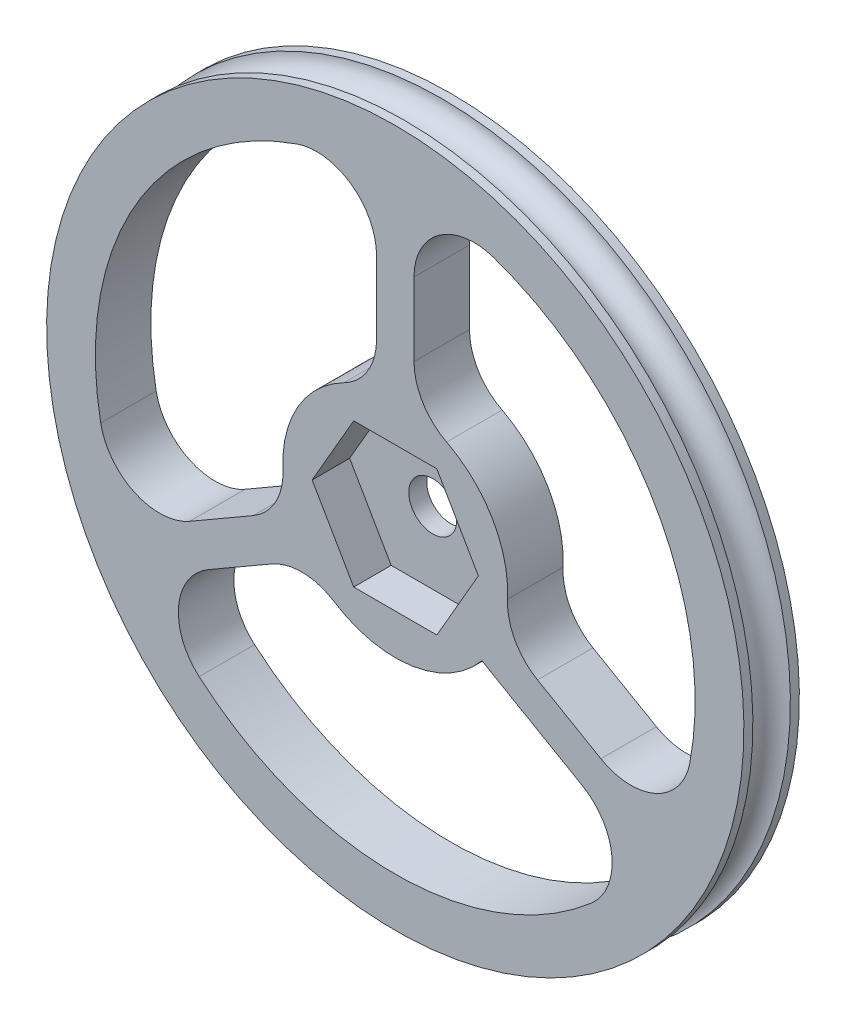
ISO-10303-21;
HEADER;
FILE_DESCRIPTION(('STEP AP214'),'2;1');
FILE_NAME('part.step','',(''),(''),'','','');
FILE_SCHEMA(('AUTOMOTIVE_DESIGN { 1 0 10303 214 1 1 1 1 }'));
ENDSEC;
DATA;
#1=APPLICATION_CONTEXT('core data for automotive mechanical design processes');
#2=APPLICATION_PROTOCOL_DEFINITION('international standard','automotive_design',2000,#1);
#3=PRODUCT_CONTEXT('',#1,'mechanical');
#4=PRODUCT('Part','Part','',(#3));
#5=PRODUCT_RELATED_PRODUCT_CATEGORY('part','',(#4));
#6=PRODUCT_DEFINITION_FORMATION('','',#4);
#7=PRODUCT_DEFINITION_CONTEXT('part definition',#1,'design');
#8=PRODUCT_DEFINITION('design','',#6,#7);
#9=PRODUCT_DEFINITION_SHAPE('','',#8);
#10=(LENGTH_UNIT() NAMED_UNIT(*) SI_UNIT(.MILLI.,.METRE.));
#11=(NAMED_UNIT(*) PLANE_ANGLE_UNIT() SI_UNIT($,.RADIAN.));
#12=(NAMED_UNIT(*) SI_UNIT($,.STERADIAN.) SOLID_ANGLE_UNIT());
#13=UNCERTAINTY_MEASURE_WITH_UNIT(LENGTH_MEASURE(1.E-05),#10,'distance_accuracy_value','');
#14=(GEOMETRIC_REPRESENTATION_CONTEXT(3) GLOBAL_UNCERTAINTY_ASSIGNED_CONTEXT((#13)) GLOBAL_UNIT_ASSIGNED_CONTEXT((#10,
#11,#12)) REPRESENTATION_CONTEXT('',''));
#15=CARTESIAN_POINT('',(0.,0.,0.));
#16=DIRECTION('',(0.,0.,1.));
#17=DIRECTION('',(1.,0.,0.));
#18=AXIS2_PLACEMENT_3D('',#15,#16,#17);
#19=CARTESIAN_POINT('',(-1.5875,0.,-4.699));
#20=DIRECTION('',(-1.,0.,0.));
#21=DIRECTION('',(0.,0.,1.));
#22=AXIS2_PLACEMENT_3D('',#19,#20,#21);
#23=PLANE('',#22);
#24=DIRECTION('',(0.,-1.,0.));
#25=VECTOR('',#24,1.);
#26=CARTESIAN_POINT('',(-1.5875,0.,0.));
#27=LINE('',#26,#25);
#28=CARTESIAN_POINT('',(-1.5875,19.1949692302436,0.));
#29=VERTEX_POINT('',#28);
#30=CARTESIAN_POINT('',(-1.5875,12.9942475253475,0.));
#31=VERTEX_POINT('',#30);
#32=EDGE_CURVE('E340',#29,#31,#27,.T.);
#33=ORIENTED_EDGE('',*,*,#32,.F.);
#34=DIRECTION('',(0.,0.,1.));
#35=VECTOR('',#34,1.);
#36=CARTESIAN_POINT('',(-1.5875,19.1949692302436,-4.699));
#37=LINE('',#36,#35);
#38=CARTESIAN_POINT('',(-1.5875,19.1949692302436,-4.699));
#39=VERTEX_POINT('',#38);
#40=EDGE_CURVE('E416',#29,#39,#37,.F.);
#41=ORIENTED_EDGE('',*,*,#40,.T.);
#42=DIRECTION('',(0.,-1.,0.));
#43=VECTOR('',#42,1.);
#44=CARTESIAN_POINT('',(-1.5875,0.,-4.699));
#45=LINE('',#44,#43);
#46=CARTESIAN_POINT('',(-1.5875,12.9942475253475,-4.699));
#47=VERTEX_POINT('',#46);
#48=EDGE_CURVE('E342',#39,#47,#45,.T.);
#49=ORIENTED_EDGE('',*,*,#48,.T.);
#50=DIRECTION('',(0.,0.,-1.));
#51=VECTOR('',#50,1.);
#52=CARTESIAN_POINT('',(-1.5875,12.9942475253475,0.));
#53=LINE('',#52,#51);
#54=EDGE_CURVE('E413',#47,#31,#53,.F.);
#55=ORIENTED_EDGE('',*,*,#54,.T.);
#56=EDGE_LOOP('',(#33,#41,#49,#55));
#57=FACE_BOUND('',#56,.T.);
#58=ADVANCED_FACE('F35',(#57),#23,.T.);
#59=CARTESIAN_POINT('',(1.5875,0.,-4.699));
#60=DIRECTION('',(1.,0.,0.));
#61=DIRECTION('',(0.,0.,-1.));
#62=AXIS2_PLACEMENT_3D('',#59,#60,#61);
#63=PLANE('',#62);
#64=DIRECTION('',(0.,1.,0.));
#65=VECTOR('',#64,1.);
#66=CARTESIAN_POINT('',(1.5875,0.,-4.699));
#67=LINE('',#66,#65);
#68=CARTESIAN_POINT('',(1.5875,12.9942475253475,-4.699));
#69=VERTEX_POINT('',#68);
#70=CARTESIAN_POINT('',(1.5875,19.1949692302436,-4.699));
#71=VERTEX_POINT('',#70);
#72=EDGE_CURVE('E349',#69,#71,#67,.T.);
#73=ORIENTED_EDGE('',*,*,#72,.T.);
#74=DIRECTION('',(0.,0.,1.));
#75=VECTOR('',#74,1.);
#76=CARTESIAN_POINT('',(1.5875,19.1949692302436,0.));
#77=LINE('',#76,#75);
#78=CARTESIAN_POINT('',(1.5875,19.1949692302436,0.));
#79=VERTEX_POINT('',#78);
#80=EDGE_CURVE('E438',#71,#79,#77,.T.);
#81=ORIENTED_EDGE('',*,*,#80,.T.);
#82=DIRECTION('',(0.,1.,0.));
#83=VECTOR('',#82,1.);
#84=CARTESIAN_POINT('',(1.5875,0.,0.));
#85=LINE('',#84,#83);
#86=CARTESIAN_POINT('',(1.5875,12.9942475253475,0.));
#87=VERTEX_POINT('',#86);
#88=EDGE_CURVE('E346',#87,#79,#85,.T.);
#89=ORIENTED_EDGE('',*,*,#88,.F.);
#90=DIRECTION('',(0.,0.,-1.));
#91=VECTOR('',#90,1.);
#92=CARTESIAN_POINT('',(1.5875,12.9942475253475,-4.699));
#93=LINE('',#92,#91);
#94=EDGE_CURVE('E436',#87,#69,#93,.T.);
#95=ORIENTED_EDGE('',*,*,#94,.T.);
#96=EDGE_LOOP('',(#73,#81,#89,#95));
#97=FACE_BOUND('',#96,.T.);
#98=ADVANCED_FACE('F492',(#97),#63,.T.);
#99=CARTESIAN_POINT('',(0.,0.,-4.699));
#100=DIRECTION('',(0.,0.,1.));
#101=DIRECTION('',(1.,0.,0.));
#102=AXIS2_PLACEMENT_3D('',#99,#100,#101);
#103=CYLINDRICAL_SURFACE('',#102,9.525);
#104=CARTESIAN_POINT('',(0.,0.,0.));
#105=DIRECTION('',(0.,0.,1.));
#106=DIRECTION('',(1.,0.,0.));
#107=AXIS2_PLACEMENT_3D('',#104,#105,#106);
#108=CIRCLE('',#107,9.525);
#109=CARTESIAN_POINT('',(9.5133250826179,-0.471456119308275,0.));
#110=VERTEX_POINT('',#109);
#111=CARTESIAN_POINT('',(4.34836956521739,8.47450925566142,0.));
#112=VERTEX_POINT('',#111);
#113=EDGE_CURVE('E369',#110,#112,#108,.T.);
#114=ORIENTED_EDGE('',*,*,#113,.F.);
#115=DIRECTION('',(0.,0.,1.));
#116=VECTOR('',#115,1.);
#117=CARTESIAN_POINT('',(9.5133250826179,-0.471456119308275,-4.699));
#118=LINE('',#117,#116);
#119=CARTESIAN_POINT('',(9.5133250826179,-0.471456119308275,-4.699));
#120=VERTEX_POINT('',#119);
#121=EDGE_CURVE('E55',#110,#120,#118,.F.);
#122=ORIENTED_EDGE('',*,*,#121,.T.);
#123=CARTESIAN_POINT('',(0.,0.,-4.699));
#124=DIRECTION('',(0.,0.,1.));
#125=DIRECTION('',(1.,0.,0.));
#126=AXIS2_PLACEMENT_3D('',#123,#124,#125);
#127=CIRCLE('',#126,9.525);
#128=CARTESIAN_POINT('',(4.34836956521739,8.47450925566142,-4.699));
#129=VERTEX_POINT('',#128);
#130=EDGE_CURVE('E347',#120,#129,#127,.T.);
#131=ORIENTED_EDGE('',*,*,#130,.T.);
#132=DIRECTION('',(0.,0.,1.));
#133=VECTOR('',#132,1.);
#134=CARTESIAN_POINT('',(4.34836956521739,8.47450925566142,-4.699));
#135=LINE('',#134,#133);
#136=EDGE_CURVE('E441',#129,#112,#135,.T.);
#137=ORIENTED_EDGE('',*,*,#136,.T.);
#138=EDGE_LOOP('',(#114,#122,#131,#137));
#139=FACE_BOUND('',#138,.T.);
#140=ADVANCED_FACE('F494',(#139),#103,.T.);
#141=CARTESIAN_POINT('',(0.793750000000738,1.37481532850908,-4.699));
#142=DIRECTION('',(0.5,0.866025403784439,0.));
#143=DIRECTION('',(-0.866025403784439,0.5,0.));
#144=AXIS2_PLACEMENT_3D('',#141,#142,#143);
#145=PLANE('',#144);
#146=DIRECTION('',(-0.866025403784439,0.5,0.));
#147=VECTOR('',#146,1.);
#148=CARTESIAN_POINT('',(0.793750000000738,1.37481532850908,0.));
#149=LINE('',#148,#147);
#150=CARTESIAN_POINT('',(17.4170809782519,-8.22266928661249,0.));
#151=VERTEX_POINT('',#150);
#152=CARTESIAN_POINT('',(12.0470984600141,-5.1223084341643,0.));
#153=VERTEX_POINT('',#152);
#154=EDGE_CURVE('E372',#151,#153,#149,.T.);
#155=ORIENTED_EDGE('',*,*,#154,.F.);
#156=DIRECTION('',(0.,0.,1.));
#157=VECTOR('',#156,1.);
#158=CARTESIAN_POINT('',(17.4170809782519,-8.22266928661248,-4.699));
#159=LINE('',#158,#157);
#160=CARTESIAN_POINT('',(17.4170809782519,-8.22266928661249,-4.699));
#161=VERTEX_POINT('',#160);
#162=EDGE_CURVE('E434',#151,#161,#159,.F.);
#163=ORIENTED_EDGE('',*,*,#162,.T.);
#164=DIRECTION('',(-0.866025403784439,0.5,0.));
#165=VECTOR('',#164,1.);
#166=CARTESIAN_POINT('',(0.793750000000738,1.37481532850908,-4.699));
#167=LINE('',#166,#165);
#168=CARTESIAN_POINT('',(12.0470984600141,-5.1223084341643,-4.699));
#169=VERTEX_POINT('',#168);
#170=EDGE_CURVE('E350',#161,#169,#167,.T.);
#171=ORIENTED_EDGE('',*,*,#170,.T.);
#172=DIRECTION('',(0.,0.,-1.));
#173=VECTOR('',#172,1.);
#174=CARTESIAN_POINT('',(12.0470984600141,-5.1223084341643,0.));
#175=LINE('',#174,#173);
#176=EDGE_CURVE('E431',#169,#153,#175,.F.);
#177=ORIENTED_EDGE('',*,*,#176,.T.);
#178=EDGE_LOOP('',(#155,#163,#171,#177));
#179=FACE_BOUND('',#178,.T.);
#180=ADVANCED_FACE('F504',(#179),#145,.T.);
#181=CARTESIAN_POINT('',(-0.793749999999262,-1.37481532850652,-4.699));
#182=DIRECTION('',(-0.5,-0.866025403784439,0.));
#183=DIRECTION('',(0.866025403784439,-0.5,0.));
#184=AXIS2_PLACEMENT_3D('',#181,#182,#183);
#185=PLANE('',#184);
#186=DIRECTION('',(0.866025403784439,-0.5,0.));
#187=VECTOR('',#186,1.);
#188=CARTESIAN_POINT('',(-0.793749999999262,-1.37481532850652,-4.699));
#189=LINE('',#188,#187);
#190=CARTESIAN_POINT('',(7.33976717048152,-6.07070365634201,-4.699));
#191=VERTEX_POINT('',#190);
#192=CARTESIAN_POINT('',(15.8295809782528,-10.9722999436286,-4.699));
#193=VERTEX_POINT('',#192);
#194=EDGE_CURVE('E358',#191,#193,#189,.T.);
#195=ORIENTED_EDGE('',*,*,#194,.T.);
#196=DIRECTION('',(0.,0.,1.));
#197=VECTOR('',#196,1.);
#198=CARTESIAN_POINT('',(15.8295809782528,-10.9722999436286,0.));
#199=LINE('',#198,#197);
#200=CARTESIAN_POINT('',(15.8295809782528,-10.9722999436286,0.));
#201=VERTEX_POINT('',#200);
#202=EDGE_CURVE('E418',#193,#201,#199,.T.);
#203=ORIENTED_EDGE('',*,*,#202,.T.);
#204=DIRECTION('',(0.866025403784439,-0.5,0.));
#205=VECTOR('',#204,1.);
#206=CARTESIAN_POINT('',(-0.793749999999262,-1.37481532850652,0.));
#207=LINE('',#206,#205);
#208=CARTESIAN_POINT('',(7.33976717048152,-6.07070365634201,0.));
#209=VERTEX_POINT('',#208);
#210=EDGE_CURVE('E380',#209,#201,#207,.T.);
#211=ORIENTED_EDGE('',*,*,#210,.F.);
#212=DIRECTION('',(0.,0.,1.));
#213=VECTOR('',#212,1.);
#214=CARTESIAN_POINT('',(7.33976717048152,-6.07070365634201,-4.699));
#215=LINE('',#214,#213);
#216=EDGE_CURVE('E365',#191,#209,#215,.T.);
#217=ORIENTED_EDGE('',*,*,#216,.F.);
#218=EDGE_LOOP('',(#195,#203,#211,#217));
#219=FACE_BOUND('',#218,.T.);
#220=ADVANCED_FACE('F591',(#219),#185,.T.);
#221=CARTESIAN_POINT('',(-5.16495551739972,-8.00305313635254,0.));
#222=VERTEX_POINT('',#221);
#223=EDGE_CURVE('E373',#222,#209,#108,.T.);
#224=ORIENTED_EDGE('',*,*,#223,.F.);
#225=DIRECTION('',(0.,0.,1.));
#226=VECTOR('',#225,1.);
#227=CARTESIAN_POINT('',(-5.16495551739972,-8.00305313635254,-4.699));
#228=LINE('',#227,#226);
#229=CARTESIAN_POINT('',(-5.16495551739972,-8.00305313635254,-4.699));
#230=VERTEX_POINT('',#229);
#231=EDGE_CURVE('E411',#222,#230,#228,.F.);
#232=ORIENTED_EDGE('',*,*,#231,.T.);
#233=EDGE_CURVE('E351',#230,#191,#127,.T.);
#234=ORIENTED_EDGE('',*,*,#233,.T.);
#235=ORIENTED_EDGE('',*,*,#216,.T.);
#236=EDGE_LOOP('',(#224,#232,#234,#235));
#237=FACE_BOUND('',#236,.T.);
#238=ADVANCED_FACE('F585',(#237),#103,.T.);
#239=CARTESIAN_POINT('',(0.793750000000592,-1.37481532850882,-4.699));
#240=DIRECTION('',(0.5,-0.866025403784438,0.));
#241=DIRECTION('',(0.866025403784438,0.5,0.));
#242=AXIS2_PLACEMENT_3D('',#239,#240,#241);
#243=PLANE('',#242);
#244=DIRECTION('',(0.866025403784438,0.5,0.));
#245=VECTOR('',#244,1.);
#246=CARTESIAN_POINT('',(0.793750000000592,-1.37481532850882,0.));
#247=LINE('',#246,#245);
#248=CARTESIAN_POINT('',(-15.8295809782507,-10.9722999436304,0.));
#249=VERTEX_POINT('',#248);
#250=CARTESIAN_POINT('',(-10.4595984600129,-7.87193909118228,0.));
#251=VERTEX_POINT('',#250);
#252=EDGE_CURVE('E377',#249,#251,#247,.T.);
#253=ORIENTED_EDGE('',*,*,#252,.F.);
#254=DIRECTION('',(0.,0.,1.));
#255=VECTOR('',#254,1.);
#256=CARTESIAN_POINT('',(-15.8295809782507,-10.9722999436304,-4.699));
#257=LINE('',#256,#255);
#258=CARTESIAN_POINT('',(-15.8295809782507,-10.9722999436304,-4.699));
#259=VERTEX_POINT('',#258);
#260=EDGE_CURVE('E409',#249,#259,#257,.F.);
#261=ORIENTED_EDGE('',*,*,#260,.T.);
#262=DIRECTION('',(0.866025403784438,0.5,0.));
#263=VECTOR('',#262,1.);
#264=CARTESIAN_POINT('',(0.793750000000592,-1.37481532850882,-4.699));
#265=LINE('',#264,#263);
#266=CARTESIAN_POINT('',(-10.4595984600129,-7.87193909118228,-4.699));
#267=VERTEX_POINT('',#266);
#268=EDGE_CURVE('E355',#259,#267,#265,.T.);
#269=ORIENTED_EDGE('',*,*,#268,.T.);
#270=DIRECTION('',(0.,0.,-1.));
#271=VECTOR('',#270,1.);
#272=CARTESIAN_POINT('',(-10.4595984600129,-7.87193909118228,0.));
#273=LINE('',#272,#271);
#274=EDGE_CURVE('E406',#267,#251,#273,.F.);
#275=ORIENTED_EDGE('',*,*,#274,.T.);
#276=EDGE_LOOP('',(#253,#261,#269,#275));
#277=FACE_BOUND('',#276,.T.);
#278=ADVANCED_FACE('F623',(#277),#243,.T.);
#279=CARTESIAN_POINT('',(-0.79374999999941,1.37481532850677,-4.699));
#280=DIRECTION('',(-0.5,0.866025403784438,0.));
#281=DIRECTION('',(-0.866025403784438,-0.500000000000001,0.));
#282=AXIS2_PLACEMENT_3D('',#279,#280,#281);
#283=PLANE('',#282);
#284=DIRECTION('',(-0.866025403784438,-0.500000000000001,0.));
#285=VECTOR('',#284,1.);
#286=CARTESIAN_POINT('',(-0.79374999999941,1.37481532850677,-4.699));
#287=LINE('',#286,#285);
#288=CARTESIAN_POINT('',(-12.047098460014,-5.1223084341673,-4.699));
#289=VERTEX_POINT('',#288);
#290=CARTESIAN_POINT('',(-17.4170809782514,-8.22266928661526,-4.699));
#291=VERTEX_POINT('',#290);
#292=EDGE_CURVE('E352',#289,#291,#287,.T.);
#293=ORIENTED_EDGE('',*,*,#292,.T.);
#294=DIRECTION('',(0.,0.,1.));
#295=VECTOR('',#294,1.);
#296=CARTESIAN_POINT('',(-17.4170809782514,-8.22266928661526,0.));
#297=LINE('',#296,#295);
#298=CARTESIAN_POINT('',(-17.4170809782514,-8.22266928661526,0.));
#299=VERTEX_POINT('',#298);
#300=EDGE_CURVE('E393',#291,#299,#297,.T.);
#301=ORIENTED_EDGE('',*,*,#300,.T.);
#302=DIRECTION('',(-0.866025403784438,-0.500000000000001,0.));
#303=VECTOR('',#302,1.);
#304=CARTESIAN_POINT('',(-0.79374999999941,1.37481532850677,0.));
#305=LINE('',#304,#303);
#306=CARTESIAN_POINT('',(-12.047098460014,-5.1223084341673,0.));
#307=VERTEX_POINT('',#306);
#308=EDGE_CURVE('E374',#307,#299,#305,.T.);
#309=ORIENTED_EDGE('',*,*,#308,.F.);
#310=DIRECTION('',(0.,0.,-1.));
#311=VECTOR('',#310,1.);
#312=CARTESIAN_POINT('',(-12.047098460014,-5.12230843416729,-4.699));
#313=LINE('',#312,#311);
#314=EDGE_CURVE('E389',#307,#289,#313,.T.);
#315=ORIENTED_EDGE('',*,*,#314,.T.);
#316=EDGE_LOOP('',(#293,#301,#309,#315));
#317=FACE_BOUND('',#316,.T.);
#318=ADVANCED_FACE('F536',(#317),#283,.T.);
#319=CARTESIAN_POINT('',(-4.34836956521739,8.47450925566142,0.));
#320=VERTEX_POINT('',#319);
#321=CARTESIAN_POINT('',(-9.5133250826178,-0.471456119310228,0.));
#322=VERTEX_POINT('',#321);
#323=EDGE_CURVE('E368',#320,#322,#108,.T.);
#324=ORIENTED_EDGE('',*,*,#323,.F.);
#325=DIRECTION('',(0.,0.,1.));
#326=VECTOR('',#325,1.);
#327=CARTESIAN_POINT('',(-4.34836956521739,8.47450925566142,-4.699));
#328=LINE('',#327,#326);
#329=CARTESIAN_POINT('',(-4.34836956521739,8.47450925566142,-4.699));
#330=VERTEX_POINT('',#329);
#331=EDGE_CURVE('E424',#320,#330,#328,.F.);
#332=ORIENTED_EDGE('',*,*,#331,.T.);
#333=CARTESIAN_POINT('',(-9.5133250826178,-0.471456119310228,-4.699));
#334=VERTEX_POINT('',#333);
#335=EDGE_CURVE('E345',#330,#334,#127,.T.);
#336=ORIENTED_EDGE('',*,*,#335,.T.);
#337=DIRECTION('',(0.,0.,1.));
#338=VECTOR('',#337,1.);
#339=CARTESIAN_POINT('',(-9.5133250826178,-0.471456119310227,-4.699));
#340=LINE('',#339,#338);
#341=EDGE_CURVE('E421',#334,#322,#340,.T.);
#342=ORIENTED_EDGE('',*,*,#341,.T.);
#343=EDGE_LOOP('',(#324,#332,#336,#342));
#344=FACE_BOUND('',#343,.T.);
#345=ADVANCED_FACE('F578',(#344),#103,.T.);
#346=CARTESIAN_POINT('',(0.,0.,-4.699));
#347=DIRECTION('',(0.,0.,1.));
#348=DIRECTION('',(1.,0.,0.));
#349=AXIS2_PLACEMENT_3D('',#346,#347,#348);
#350=PLANE('',#349);
#351=CARTESIAN_POINT('',(0.,0.,-4.699));
#352=DIRECTION('',(0.,0.,1.));
#353=DIRECTION('',(1.,0.,0.));
#354=AXIS2_PLACEMENT_3D('',#351,#352,#353);
#355=CIRCLE('',#354,2.032);
#356=CARTESIAN_POINT('',(2.032,0.,-4.699));
#357=VERTEX_POINT('',#356);
#358=EDGE_CURVE('E275',#357,#357,#355,.T.);
#359=ORIENTED_EDGE('',*,*,#358,.T.);
#360=EDGE_LOOP('',(#359));
#361=FACE_BOUND('',#360,.T.);
#362=ORIENTED_EDGE('',*,*,#170,.F.);
#363=CARTESIAN_POINT('',(19.9570809782519,-3.82326023538754,-4.699));
#364=DIRECTION('',(0.,0.,1.));
#365=DIRECTION('',(1.,0.,0.));
#366=AXIS2_PLACEMENT_3D('',#363,#364,#365);
#367=CIRCLE('',#366,5.08);
#368=CARTESIAN_POINT('',(24.9463512228149,-4.77907529423442,-4.699));
#369=VERTEX_POINT('',#368);
#370=EDGE_CURVE('E475',#161,#369,#367,.T.);
#371=ORIENTED_EDGE('',*,*,#370,.T.);
#372=CARTESIAN_POINT('',(0.,0.,-4.699));
#373=DIRECTION('',(0.,0.,-1.));
#374=DIRECTION('',(-1.,0.,0.));
#375=AXIS2_PLACEMENT_3D('',#372,#373,#374);
#376=CIRCLE('',#375,25.4);
#377=CARTESIAN_POINT('',(8.334375,23.9937115378045,-4.699));
#378=VERTEX_POINT('',#377);
#379=EDGE_CURVE('E337',#378,#369,#376,.T.);
#380=ORIENTED_EDGE('',*,*,#379,.F.);
#381=CARTESIAN_POINT('',(6.6675,19.1949692302436,-4.699));
#382=DIRECTION('',(0.,0.,1.));
#383=DIRECTION('',(1.,0.,0.));
#384=AXIS2_PLACEMENT_3D('',#381,#382,#383);
#385=CIRCLE('',#384,5.08);
#386=EDGE_CURVE('E479',#378,#71,#385,.T.);
#387=ORIENTED_EDGE('',*,*,#386,.T.);
#388=ORIENTED_EDGE('',*,*,#72,.F.);
#389=CARTESIAN_POINT('',(6.6675,12.9942475253475,-4.699));
#390=DIRECTION('',(0.,0.,1.));
#391=DIRECTION('',(1.,0.,0.));
#392=AXIS2_PLACEMENT_3D('',#389,#390,#391);
#393=CIRCLE('',#392,5.08);
#394=EDGE_CURVE('E11',#69,#129,#393,.T.);
#395=ORIENTED_EDGE('',*,*,#394,.T.);
#396=ORIENTED_EDGE('',*,*,#130,.F.);
#397=CARTESIAN_POINT('',(14.5870984600141,-0.722899382939355,-4.699));
#398=DIRECTION('',(0.,0.,1.));
#399=DIRECTION('',(1.,0.,0.));
#400=AXIS2_PLACEMENT_3D('',#397,#398,#399);
#401=CIRCLE('',#400,5.08);
#402=EDGE_CURVE('E483',#120,#169,#401,.T.);
#403=ORIENTED_EDGE('',*,*,#402,.T.);
#404=EDGE_LOOP('',(#362,#371,#380,#387,#388,#395,#396,#403));
#405=FACE_BOUND('',#404,.T.);
#406=ORIENTED_EDGE('',*,*,#268,.F.);
#407=CARTESIAN_POINT('',(-13.2895809782507,-15.3717089948554,-4.699));
#408=DIRECTION('',(0.,0.,1.));
#409=DIRECTION('',(1.,0.,0.));
#410=AXIS2_PLACEMENT_3D('',#407,#408,#409);
#411=CIRCLE('',#410,5.08);
#412=CARTESIAN_POINT('',(-16.6119762228133,-19.2146362435692,-4.699));
#413=VERTEX_POINT('',#412);
#414=EDGE_CURVE('E451',#259,#413,#411,.T.);
#415=ORIENTED_EDGE('',*,*,#414,.T.);
#416=CARTESIAN_POINT('',(16.611976222816,-19.2146362435669,-4.699));
#417=VERTEX_POINT('',#416);
#418=EDGE_CURVE('E341',#417,#413,#376,.T.);
#419=ORIENTED_EDGE('',*,*,#418,.F.);
#420=CARTESIAN_POINT('',(13.2895809782528,-15.3717089948535,-4.699));
#421=DIRECTION('',(0.,0.,1.));
#422=DIRECTION('',(1.,0.,0.));
#423=AXIS2_PLACEMENT_3D('',#420,#421,#422);
#424=CIRCLE('',#423,5.08);
#425=EDGE_CURVE('E463',#417,#193,#424,.T.);
#426=ORIENTED_EDGE('',*,*,#425,.T.);
#427=ORIENTED_EDGE('',*,*,#194,.F.);
#428=ORIENTED_EDGE('',*,*,#233,.F.);
#429=CARTESIAN_POINT('',(-7.9195984600129,-12.2713481424072,-4.699));
#430=DIRECTION('',(0.,0.,1.));
#431=DIRECTION('',(1.,0.,0.));
#432=AXIS2_PLACEMENT_3D('',#429,#430,#431);
#433=CIRCLE('',#432,5.08);
#434=EDGE_CURVE('E455',#230,#267,#433,.T.);
#435=ORIENTED_EDGE('',*,*,#434,.T.);
#436=EDGE_LOOP('',(#406,#415,#419,#426,#427,#428,#435));
#437=FACE_BOUND('',#436,.T.);
#438=CARTESIAN_POINT('',(0.,0.,-4.699));
#439=DIRECTION('',(0.,0.,-1.));
#440=DIRECTION('',(-1.,0.,0.));
#441=AXIS2_PLACEMENT_3D('',#438,#439,#440);
#442=CIRCLE('',#441,29.5275);
#443=CARTESIAN_POINT('',(0.,29.5275,-4.699));
#444=VERTEX_POINT('',#443);
#445=EDGE_CURVE('E333',#444,#444,#442,.T.);
#446=ORIENTED_EDGE('',*,*,#445,.T.);
#447=EDGE_LOOP('',(#446));
#448=FACE_BOUND('',#447,.T.);
#449=ORIENTED_EDGE('',*,*,#48,.F.);
#450=CARTESIAN_POINT('',(-6.6675,19.1949692302436,-4.699));
#451=DIRECTION('',(0.,0.,1.));
#452=DIRECTION('',(1.,0.,0.));
#453=AXIS2_PLACEMENT_3D('',#450,#451,#452);
#454=CIRCLE('',#453,5.08);
#455=CARTESIAN_POINT('',(-8.334375,23.9937115378045,-4.699));
#456=VERTEX_POINT('',#455);
#457=EDGE_CURVE('E459',#39,#456,#454,.T.);
#458=ORIENTED_EDGE('',*,*,#457,.T.);
#459=CARTESIAN_POINT('',(-24.9463512228142,-4.77907529423789,-4.699));
#460=VERTEX_POINT('',#459);
#461=EDGE_CURVE('E336',#460,#456,#376,.T.);
#462=ORIENTED_EDGE('',*,*,#461,.F.);
#463=CARTESIAN_POINT('',(-19.9570809782514,-3.82326023539031,-4.699));
#464=DIRECTION('',(0.,0.,1.));
#465=DIRECTION('',(1.,0.,0.));
#466=AXIS2_PLACEMENT_3D('',#463,#464,#465);
#467=CIRCLE('',#466,5.08);
#468=EDGE_CURVE('E447',#460,#291,#467,.T.);
#469=ORIENTED_EDGE('',*,*,#468,.T.);
#470=ORIENTED_EDGE('',*,*,#292,.F.);
#471=CARTESIAN_POINT('',(-14.587098460014,-0.722899382942349,-4.699));
#472=DIRECTION('',(0.,0.,1.));
#473=DIRECTION('',(1.,0.,0.));
#474=AXIS2_PLACEMENT_3D('',#471,#472,#473);
#475=CIRCLE('',#474,5.08);
#476=EDGE_CURVE('E471',#289,#334,#475,.T.);
#477=ORIENTED_EDGE('',*,*,#476,.T.);
#478=ORIENTED_EDGE('',*,*,#335,.F.);
#479=CARTESIAN_POINT('',(-6.6675,12.9942475253475,-4.699));
#480=DIRECTION('',(0.,0.,1.));
#481=DIRECTION('',(1.,0.,0.));
#482=AXIS2_PLACEMENT_3D('',#479,#480,#481);
#483=CIRCLE('',#482,5.08);
#484=EDGE_CURVE('E467',#330,#47,#483,.T.);
#485=ORIENTED_EDGE('',*,*,#484,.T.);
#486=EDGE_LOOP('',(#449,#458,#462,#469,#470,#477,#478,#485));
#487=FACE_BOUND('',#486,.T.);
#488=ADVANCED_FACE('F497',(#361,#405,#437,#448,#487),#350,.F.);
#489=CARTESIAN_POINT('',(0.,0.,0.));
#490=DIRECTION('',(0.,0.,1.));
#491=DIRECTION('',(1.,0.,0.));
#492=AXIS2_PLACEMENT_3D('',#489,#490,#491);
#493=PLANE('',#492);
#494=DIRECTION('',(0.499999999999995,0.866025403784442,0.));
#495=VECTOR('',#494,1.);
#496=CARTESIAN_POINT('',(3.51952724098003,-6.09599999999996,0.));
#497=LINE('',#496,#495);
#498=CARTESIAN_POINT('',(3.51952724098003,-6.09599999999996,0.));
#499=VERTEX_POINT('',#498);
#500=CARTESIAN_POINT('',(7.03905448195992,0.,0.));
#501=VERTEX_POINT('',#500);
#502=EDGE_CURVE('E251',#499,#501,#497,.T.);
#503=ORIENTED_EDGE('',*,*,#502,.F.);
#504=DIRECTION('',(1.,0.,0.));
#505=VECTOR('',#504,1.);
#506=CARTESIAN_POINT('',(-3.5195272409799,-6.09600000000004,0.));
#507=LINE('',#506,#505);
#508=CARTESIAN_POINT('',(-3.5195272409799,-6.09600000000004,0.));
#509=VERTEX_POINT('',#508);
#510=EDGE_CURVE('E269',#509,#499,#507,.T.);
#511=ORIENTED_EDGE('',*,*,#510,.F.);
#512=DIRECTION('',(0.500000000000007,-0.866025403784435,0.));
#513=VECTOR('',#512,1.);
#514=CARTESIAN_POINT('',(-7.03905448195992,0.,0.));
#515=LINE('',#514,#513);
#516=CARTESIAN_POINT('',(-7.03905448195992,0.,0.));
#517=VERTEX_POINT('',#516);
#518=EDGE_CURVE('E272',#517,#509,#515,.T.);
#519=ORIENTED_EDGE('',*,*,#518,.F.);
#520=DIRECTION('',(-0.499999999999995,-0.866025403784442,0.));
#521=VECTOR('',#520,1.);
#522=CARTESIAN_POINT('',(-3.51952724097999,6.09599999999999,0.));
#523=LINE('',#522,#521);
#524=CARTESIAN_POINT('',(-3.51952724097999,6.09599999999999,0.));
#525=VERTEX_POINT('',#524);
#526=EDGE_CURVE('E291',#525,#517,#523,.T.);
#527=ORIENTED_EDGE('',*,*,#526,.F.);
#528=DIRECTION('',(-1.,0.,0.));
#529=VECTOR('',#528,1.);
#530=CARTESIAN_POINT('',(3.51952724097995,6.09600000000001,0.));
#531=LINE('',#530,#529);
#532=CARTESIAN_POINT('',(3.51952724097995,6.09600000000001,0.));
#533=VERTEX_POINT('',#532);
#534=EDGE_CURVE('E288',#533,#525,#531,.T.);
#535=ORIENTED_EDGE('',*,*,#534,.F.);
#536=DIRECTION('',(-0.500000000000001,0.866025403784438,0.));
#537=VECTOR('',#536,1.);
#538=CARTESIAN_POINT('',(7.03905448195992,0.,0.));
#539=LINE('',#538,#537);
#540=EDGE_CURVE('E285',#501,#533,#539,.T.);
#541=ORIENTED_EDGE('',*,*,#540,.F.);
#542=EDGE_LOOP('',(#503,#511,#519,#527,#535,#541));
#543=FACE_BOUND('',#542,.T.);
#544=ORIENTED_EDGE('',*,*,#88,.T.);
#545=CARTESIAN_POINT('',(6.6675,19.1949692302436,0.));
#546=DIRECTION('',(0.,0.,1.));
#547=DIRECTION('',(1.,0.,0.));
#548=AXIS2_PLACEMENT_3D('',#545,#546,#547);
#549=CIRCLE('',#548,5.08);
#550=CARTESIAN_POINT('',(8.334375,23.9937115378045,0.));
#551=VERTEX_POINT('',#550);
#552=EDGE_CURVE('E477',#79,#551,#549,.F.);
#553=ORIENTED_EDGE('',*,*,#552,.T.);
#554=CARTESIAN_POINT('',(0.,0.,0.));
#555=DIRECTION('',(0.,0.,-1.));
#556=DIRECTION('',(-1.,0.,0.));
#557=AXIS2_PLACEMENT_3D('',#554,#555,#556);
#558=CIRCLE('',#557,25.4);
#559=CARTESIAN_POINT('',(24.9463512228149,-4.77907529423442,0.));
#560=VERTEX_POINT('',#559);
#561=EDGE_CURVE('E320',#551,#560,#558,.T.);
#562=ORIENTED_EDGE('',*,*,#561,.T.);
#563=CARTESIAN_POINT('',(19.9570809782519,-3.82326023538754,0.));
#564=DIRECTION('',(0.,0.,1.));
#565=DIRECTION('',(1.,0.,0.));
#566=AXIS2_PLACEMENT_3D('',#563,#564,#565);
#567=CIRCLE('',#566,5.08);
#568=EDGE_CURVE('E473',#560,#151,#567,.F.);
#569=ORIENTED_EDGE('',*,*,#568,.T.);
#570=ORIENTED_EDGE('',*,*,#154,.T.);
#571=CARTESIAN_POINT('',(14.5870984600141,-0.722899382939355,0.));
#572=DIRECTION('',(0.,0.,1.));
#573=DIRECTION('',(1.,0.,0.));
#574=AXIS2_PLACEMENT_3D('',#571,#572,#573);
#575=CIRCLE('',#574,5.08);
#576=EDGE_CURVE('E481',#153,#110,#575,.F.);
#577=ORIENTED_EDGE('',*,*,#576,.T.);
#578=ORIENTED_EDGE('',*,*,#113,.T.);
#579=CARTESIAN_POINT('',(6.6675,12.9942475253475,0.));
#580=DIRECTION('',(0.,0.,1.));
#581=DIRECTION('',(1.,0.,0.));
#582=AXIS2_PLACEMENT_3D('',#579,#580,#581);
#583=CIRCLE('',#582,5.08);
#584=EDGE_CURVE('E43',#112,#87,#583,.F.);
#585=ORIENTED_EDGE('',*,*,#584,.T.);
#586=EDGE_LOOP('',(#544,#553,#562,#569,#570,#577,#578,#585));
#587=FACE_BOUND('',#586,.T.);
#588=ORIENTED_EDGE('',*,*,#210,.T.);
#589=CARTESIAN_POINT('',(13.2895809782528,-15.3717089948535,0.));
#590=DIRECTION('',(0.,0.,1.));
#591=DIRECTION('',(1.,0.,0.));
#592=AXIS2_PLACEMENT_3D('',#589,#590,#591);
#593=CIRCLE('',#592,5.08);
#594=CARTESIAN_POINT('',(16.611976222816,-19.2146362435669,0.));
#595=VERTEX_POINT('',#594);
#596=EDGE_CURVE('E461',#201,#595,#593,.F.);
#597=ORIENTED_EDGE('',*,*,#596,.T.);
#598=CARTESIAN_POINT('',(-16.6119762228133,-19.2146362435692,0.));
#599=VERTEX_POINT('',#598);
#600=EDGE_CURVE('E324',#595,#599,#558,.T.);
#601=ORIENTED_EDGE('',*,*,#600,.T.);
#602=CARTESIAN_POINT('',(-13.2895809782507,-15.3717089948554,0.));
#603=DIRECTION('',(0.,0.,1.));
#604=DIRECTION('',(1.,0.,0.));
#605=AXIS2_PLACEMENT_3D('',#602,#603,#604);
#606=CIRCLE('',#605,5.08);
#607=EDGE_CURVE('E449',#599,#249,#606,.F.);
#608=ORIENTED_EDGE('',*,*,#607,.T.);
#609=ORIENTED_EDGE('',*,*,#252,.T.);
#610=CARTESIAN_POINT('',(-7.9195984600129,-12.2713481424072,0.));
#611=DIRECTION('',(0.,0.,1.));
#612=DIRECTION('',(1.,0.,0.));
#613=AXIS2_PLACEMENT_3D('',#610,#611,#612);
#614=CIRCLE('',#613,5.08);
#615=EDGE_CURVE('E453',#251,#222,#614,.F.);
#616=ORIENTED_EDGE('',*,*,#615,.T.);
#617=ORIENTED_EDGE('',*,*,#223,.T.);
#618=EDGE_LOOP('',(#588,#597,#601,#608,#609,#616,#617));
#619=FACE_BOUND('',#618,.T.);
#620=CARTESIAN_POINT('',(0.,0.,0.));
#621=DIRECTION('',(0.,0.,-1.));
#622=DIRECTION('',(-1.,0.,0.));
#623=AXIS2_PLACEMENT_3D('',#620,#621,#622);
#624=CIRCLE('',#623,29.5275);
#625=CARTESIAN_POINT('',(0.,29.5275,0.));
#626=VERTEX_POINT('',#625);
#627=EDGE_CURVE('E323',#626,#626,#624,.T.);
#628=ORIENTED_EDGE('',*,*,#627,.F.);
#629=EDGE_LOOP('',(#628));
#630=FACE_BOUND('',#629,.T.);
#631=CARTESIAN_POINT('',(-24.9463512228142,-4.77907529423789,0.));
#632=VERTEX_POINT('',#631);
#633=CARTESIAN_POINT('',(-8.334375,23.9937115378045,0.));
#634=VERTEX_POINT('',#633);
#635=EDGE_CURVE('E319',#632,#634,#558,.T.);
#636=ORIENTED_EDGE('',*,*,#635,.T.);
#637=CARTESIAN_POINT('',(-6.6675,19.1949692302436,0.));
#638=DIRECTION('',(0.,0.,1.));
#639=DIRECTION('',(1.,0.,0.));
#640=AXIS2_PLACEMENT_3D('',#637,#638,#639);
#641=CIRCLE('',#640,5.08);
#642=EDGE_CURVE('E457',#634,#29,#641,.F.);
#643=ORIENTED_EDGE('',*,*,#642,.T.);
#644=ORIENTED_EDGE('',*,*,#32,.T.);
#645=CARTESIAN_POINT('',(-6.6675,12.9942475253475,0.));
#646=DIRECTION('',(0.,0.,1.));
#647=DIRECTION('',(1.,0.,0.));
#648=AXIS2_PLACEMENT_3D('',#645,#646,#647);
#649=CIRCLE('',#648,5.08);
#650=EDGE_CURVE('E465',#31,#320,#649,.F.);
#651=ORIENTED_EDGE('',*,*,#650,.T.);
#652=ORIENTED_EDGE('',*,*,#323,.T.);
#653=CARTESIAN_POINT('',(-14.587098460014,-0.722899382942349,0.));
#654=DIRECTION('',(0.,0.,1.));
#655=DIRECTION('',(1.,0.,0.));
#656=AXIS2_PLACEMENT_3D('',#653,#654,#655);
#657=CIRCLE('',#656,5.08);
#658=EDGE_CURVE('E469',#322,#307,#657,.F.);
#659=ORIENTED_EDGE('',*,*,#658,.T.);
#660=ORIENTED_EDGE('',*,*,#308,.T.);
#661=CARTESIAN_POINT('',(-19.9570809782514,-3.82326023539031,0.));
#662=DIRECTION('',(0.,0.,1.));
#663=DIRECTION('',(1.,0.,0.));
#664=AXIS2_PLACEMENT_3D('',#661,#662,#663);
#665=CIRCLE('',#664,5.08);
#666=EDGE_CURVE('E445',#299,#632,#665,.F.);
#667=ORIENTED_EDGE('',*,*,#666,.T.);
#668=EDGE_LOOP('',(#636,#643,#644,#651,#652,#659,#660,#667));
#669=FACE_BOUND('',#668,.T.);
#670=ADVANCED_FACE('F486',(#543,#587,#619,#630,#669),#493,.T.);
#671=CARTESIAN_POINT('',(0.,0.,0.));
#672=DIRECTION('',(0.,0.,-1.));
#673=DIRECTION('',(-1.,0.,0.));
#674=AXIS2_PLACEMENT_3D('',#671,#672,#673);
#675=CYLINDRICAL_SURFACE('',#674,25.4);
#676=ORIENTED_EDGE('',*,*,#379,.T.);
#677=DIRECTION('',(0.,0.,-1.));
#678=VECTOR('',#677,1.);
#679=CARTESIAN_POINT('',(24.9463512228149,-4.77907529423442,0.));
#680=LINE('',#679,#678);
#681=EDGE_CURVE('E428',#369,#560,#680,.F.);
#682=ORIENTED_EDGE('',*,*,#681,.T.);
#683=ORIENTED_EDGE('',*,*,#561,.F.);
#684=DIRECTION('',(0.,0.,-1.));
#685=VECTOR('',#684,1.);
#686=CARTESIAN_POINT('',(8.334375,23.9937115378045,0.));
#687=LINE('',#686,#685);
#688=EDGE_CURVE('E426',#551,#378,#687,.T.);
#689=ORIENTED_EDGE('',*,*,#688,.T.);
#690=EDGE_LOOP('',(#676,#682,#683,#689));
#691=FACE_BOUND('',#690,.T.);
#692=ADVANCED_FACE('F512',(#691),#675,.F.);
#693=ORIENTED_EDGE('',*,*,#418,.T.);
#694=DIRECTION('',(0.,0.,-1.));
#695=VECTOR('',#694,1.);
#696=CARTESIAN_POINT('',(-16.6119762228133,-19.2146362435692,0.));
#697=LINE('',#696,#695);
#698=EDGE_CURVE('E403',#413,#599,#697,.F.);
#699=ORIENTED_EDGE('',*,*,#698,.T.);
#700=ORIENTED_EDGE('',*,*,#600,.F.);
#701=DIRECTION('',(0.,0.,-1.));
#702=VECTOR('',#701,1.);
#703=CARTESIAN_POINT('',(16.611976222816,-19.2146362435669,0.));
#704=LINE('',#703,#702);
#705=EDGE_CURVE('E401',#595,#417,#704,.T.);
#706=ORIENTED_EDGE('',*,*,#705,.T.);
#707=EDGE_LOOP('',(#693,#699,#700,#706));
#708=FACE_BOUND('',#707,.T.);
#709=ADVANCED_FACE('F618',(#708),#675,.F.);
#710=ORIENTED_EDGE('',*,*,#635,.F.);
#711=DIRECTION('',(0.,0.,-1.));
#712=VECTOR('',#711,1.);
#713=CARTESIAN_POINT('',(-24.9463512228142,-4.77907529423789,0.));
#714=LINE('',#713,#712);
#715=EDGE_CURVE('E399',#632,#460,#714,.T.);
#716=ORIENTED_EDGE('',*,*,#715,.T.);
#717=ORIENTED_EDGE('',*,*,#461,.T.);
#718=DIRECTION('',(0.,0.,-1.));
#719=VECTOR('',#718,1.);
#720=CARTESIAN_POINT('',(-8.334375,23.9937115378045,0.));
#721=LINE('',#720,#719);
#722=EDGE_CURVE('E396',#456,#634,#721,.F.);
#723=ORIENTED_EDGE('',*,*,#722,.T.);
#724=EDGE_LOOP('',(#710,#716,#717,#723));
#725=FACE_BOUND('',#724,.T.);
#726=ADVANCED_FACE('F614',(#725),#675,.F.);
#727=CARTESIAN_POINT('',(0.,0.,0.));
#728=DIRECTION('',(0.,0.,-1.));
#729=DIRECTION('',(-1.,0.,0.));
#730=AXIS2_PLACEMENT_3D('',#727,#728,#729);
#731=CYLINDRICAL_SURFACE('',#730,29.5275);
#732=DIRECTION('',(0.,0.,1.));
#733=VECTOR('',#732,1.);
#734=CARTESIAN_POINT('',(0.,29.5275,-3.937));
#735=LINE('',#734,#733);
#736=CARTESIAN_POINT('',(0.,29.5275,-3.937));
#737=VERTEX_POINT('',#736);
#738=EDGE_CURVE('E308',#444,#737,#735,.T.);
#739=ORIENTED_EDGE('',*,*,#738,.F.);
#740=ORIENTED_EDGE('',*,*,#445,.F.);
#741=ORIENTED_EDGE('',*,*,#738,.T.);
#742=CARTESIAN_POINT('',(0.,0.,-3.937));
#743=DIRECTION('',(0.,0.,-1.));
#744=DIRECTION('',(-1.,0.,0.));
#745=AXIS2_PLACEMENT_3D('',#742,#743,#744);
#746=CIRCLE('',#745,29.5275);
#747=EDGE_CURVE('E330',#737,#737,#746,.T.);
#748=ORIENTED_EDGE('',*,*,#747,.T.);
#749=EDGE_LOOP('',(#739,#740,#741,#748));
#750=FACE_BOUND('',#749,.T.);
#751=ADVANCED_FACE('F646',(#750),#731,.T.);
#752=CARTESIAN_POINT('',(0.,0.,-2.3495));
#753=DIRECTION('',(0.,0.,-1.));
#754=DIRECTION('',(-1.,0.,0.));
#755=AXIS2_PLACEMENT_3D('',#752,#753,#754);
#756=TOROIDAL_SURFACE('',#755,29.5275,1.5875);
#757=CARTESIAN_POINT('',(0.,29.5275,-2.3495));
#758=DIRECTION('',(-1.,0.,0.));
#759=DIRECTION('',(0.,0.,-1.));
#760=AXIS2_PLACEMENT_3D('',#757,#758,#759);
#761=CIRCLE('',#760,1.5875);
#762=CARTESIAN_POINT('',(0.,29.5275,-0.762));
#763=VERTEX_POINT('',#762);
#764=EDGE_CURVE('E311',#737,#763,#761,.T.);
#765=ORIENTED_EDGE('',*,*,#764,.F.);
#766=ORIENTED_EDGE('',*,*,#747,.F.);
#767=ORIENTED_EDGE('',*,*,#764,.T.);
#768=CARTESIAN_POINT('',(0.,0.,-0.762));
#769=DIRECTION('',(0.,0.,-1.));
#770=DIRECTION('',(-1.,0.,0.));
#771=AXIS2_PLACEMENT_3D('',#768,#769,#770);
#772=CIRCLE('',#771,29.5275);
#773=EDGE_CURVE('E327',#763,#763,#772,.T.);
#774=ORIENTED_EDGE('',*,*,#773,.T.);
#775=EDGE_LOOP('',(#765,#766,#767,#774));
#776=FACE_BOUND('',#775,.T.);
#777=ADVANCED_FACE('F649',(#776),#756,.F.);
#778=CARTESIAN_POINT('',(0.,0.,0.));
#779=DIRECTION('',(0.,0.,-1.));
#780=DIRECTION('',(-1.,0.,0.));
#781=AXIS2_PLACEMENT_3D('',#778,#779,#780);
#782=CYLINDRICAL_SURFACE('',#781,29.5275);
#783=DIRECTION('',(0.,0.,1.));
#784=VECTOR('',#783,1.);
#785=CARTESIAN_POINT('',(0.,29.5275,0.));
#786=LINE('',#785,#784);
#787=EDGE_CURVE('E314',#763,#626,#786,.T.);
#788=ORIENTED_EDGE('',*,*,#787,.F.);
#789=ORIENTED_EDGE('',*,*,#773,.F.);
#790=ORIENTED_EDGE('',*,*,#787,.T.);
#791=ORIENTED_EDGE('',*,*,#627,.T.);
#792=EDGE_LOOP('',(#788,#789,#790,#791));
#793=FACE_BOUND('',#792,.T.);
#794=ADVANCED_FACE('F653',(#793),#782,.T.);
#795=CARTESIAN_POINT('',(3.51952724098003,-6.09599999999996,-3.175));
#796=DIRECTION('',(0.866025403784442,-0.499999999999995,0.));
#797=DIRECTION('',(0.499999999999995,0.866025403784442,0.));
#798=AXIS2_PLACEMENT_3D('',#795,#796,#797);
#799=PLANE('',#798);
#800=ORIENTED_EDGE('',*,*,#502,.T.);
#801=DIRECTION('',(0.,0.,1.));
#802=VECTOR('',#801,1.);
#803=CARTESIAN_POINT('',(7.03905448195992,0.,-3.175));
#804=LINE('',#803,#802);
#805=CARTESIAN_POINT('',(7.03905448195992,0.,-3.175));
#806=VERTEX_POINT('',#805);
#807=EDGE_CURVE('E244',#806,#501,#804,.T.);
#808=ORIENTED_EDGE('',*,*,#807,.F.);
#809=DIRECTION('',(0.499999999999995,0.866025403784442,0.));
#810=VECTOR('',#809,1.);
#811=CARTESIAN_POINT('',(3.51952724098003,-6.09599999999996,-3.175));
#812=LINE('',#811,#810);
#813=CARTESIAN_POINT('',(3.51952724098003,-6.09599999999996,-3.175));
#814=VERTEX_POINT('',#813);
#815=EDGE_CURVE('E248',#814,#806,#812,.T.);
#816=ORIENTED_EDGE('',*,*,#815,.F.);
#817=DIRECTION('',(0.,0.,1.));
#818=VECTOR('',#817,1.);
#819=CARTESIAN_POINT('',(3.51952724098003,-6.09599999999996,-3.175));
#820=LINE('',#819,#818);
#821=EDGE_CURVE('E296',#814,#499,#820,.T.);
#822=ORIENTED_EDGE('',*,*,#821,.T.);
#823=EDGE_LOOP('',(#800,#808,#816,#822));
#824=FACE_BOUND('',#823,.T.);
#825=ADVANCED_FACE('F246',(#824),#799,.F.);
#826=CARTESIAN_POINT('',(-3.5195272409799,-6.09600000000004,-3.175));
#827=DIRECTION('',(0.,-1.,0.));
#828=DIRECTION('',(1.,0.,0.));
#829=AXIS2_PLACEMENT_3D('',#826,#827,#828);
#830=PLANE('',#829);
#831=ORIENTED_EDGE('',*,*,#510,.T.);
#832=ORIENTED_EDGE('',*,*,#821,.F.);
#833=DIRECTION('',(1.,0.,0.));
#834=VECTOR('',#833,1.);
#835=CARTESIAN_POINT('',(-3.5195272409799,-6.09600000000004,-3.175));
#836=LINE('',#835,#834);
#837=CARTESIAN_POINT('',(-3.5195272409799,-6.09600000000004,-3.175));
#838=VERTEX_POINT('',#837);
#839=EDGE_CURVE('E256',#838,#814,#836,.T.);
#840=ORIENTED_EDGE('',*,*,#839,.F.);
#841=DIRECTION('',(0.,0.,1.));
#842=VECTOR('',#841,1.);
#843=CARTESIAN_POINT('',(-3.5195272409799,-6.09600000000004,-3.175));
#844=LINE('',#843,#842);
#845=EDGE_CURVE('E299',#838,#509,#844,.T.);
#846=ORIENTED_EDGE('',*,*,#845,.T.);
#847=EDGE_LOOP('',(#831,#832,#840,#846));
#848=FACE_BOUND('',#847,.T.);
#849=ADVANCED_FACE('F660',(#848),#830,.F.);
#850=CARTESIAN_POINT('',(-7.03905448195992,0.,-3.175));
#851=DIRECTION('',(-0.866025403784434,-0.500000000000007,0.));
#852=DIRECTION('',(0.500000000000007,-0.866025403784435,0.));
#853=AXIS2_PLACEMENT_3D('',#850,#851,#852);
#854=PLANE('',#853);
#855=ORIENTED_EDGE('',*,*,#518,.T.);
#856=ORIENTED_EDGE('',*,*,#845,.F.);
#857=DIRECTION('',(0.500000000000007,-0.866025403784435,0.));
#858=VECTOR('',#857,1.);
#859=CARTESIAN_POINT('',(-7.03905448195992,0.,-3.175));
#860=LINE('',#859,#858);
#861=CARTESIAN_POINT('',(-7.03905448195992,0.,-3.175));
#862=VERTEX_POINT('',#861);
#863=EDGE_CURVE('E281',#862,#838,#860,.T.);
#864=ORIENTED_EDGE('',*,*,#863,.F.);
#865=DIRECTION('',(0.,0.,1.));
#866=VECTOR('',#865,1.);
#867=CARTESIAN_POINT('',(-7.03905448195992,0.,-3.175));
#868=LINE('',#867,#866);
#869=EDGE_CURVE('E301',#862,#517,#868,.T.);
#870=ORIENTED_EDGE('',*,*,#869,.T.);
#871=EDGE_LOOP('',(#855,#856,#864,#870));
#872=FACE_BOUND('',#871,.T.);
#873=ADVANCED_FACE('F670',(#872),#854,.F.);
#874=CARTESIAN_POINT('',(-3.51952724097999,6.09599999999999,-3.175));
#875=DIRECTION('',(-0.866025403784441,0.499999999999995,0.));
#876=DIRECTION('',(-0.499999999999995,-0.866025403784442,0.));
#877=AXIS2_PLACEMENT_3D('',#874,#875,#876);
#878=PLANE('',#877);
#879=ORIENTED_EDGE('',*,*,#526,.T.);
#880=ORIENTED_EDGE('',*,*,#869,.F.);
#881=DIRECTION('',(-0.499999999999995,-0.866025403784442,0.));
#882=VECTOR('',#881,1.);
#883=CARTESIAN_POINT('',(-3.51952724097999,6.09599999999999,-3.175));
#884=LINE('',#883,#882);
#885=CARTESIAN_POINT('',(-3.51952724097999,6.09599999999999,-3.175));
#886=VERTEX_POINT('',#885);
#887=EDGE_CURVE('E278',#886,#862,#884,.T.);
#888=ORIENTED_EDGE('',*,*,#887,.F.);
#889=DIRECTION('',(0.,0.,1.));
#890=VECTOR('',#889,1.);
#891=CARTESIAN_POINT('',(-3.51952724097999,6.09599999999999,-3.175));
#892=LINE('',#891,#890);
#893=EDGE_CURVE('E303',#886,#525,#892,.T.);
#894=ORIENTED_EDGE('',*,*,#893,.T.);
#895=EDGE_LOOP('',(#879,#880,#888,#894));
#896=FACE_BOUND('',#895,.T.);
#897=ADVANCED_FACE('F666',(#896),#878,.F.);
#898=CARTESIAN_POINT('',(3.51952724097995,6.09600000000001,-3.175));
#899=DIRECTION('',(0.,1.,0.));
#900=DIRECTION('',(-1.,0.,0.));
#901=AXIS2_PLACEMENT_3D('',#898,#899,#900);
#902=PLANE('',#901);
#903=ORIENTED_EDGE('',*,*,#534,.T.);
#904=ORIENTED_EDGE('',*,*,#893,.F.);
#905=DIRECTION('',(-1.,0.,0.));
#906=VECTOR('',#905,1.);
#907=CARTESIAN_POINT('',(3.51952724097995,6.09600000000001,-3.175));
#908=LINE('',#907,#906);
#909=CARTESIAN_POINT('',(3.51952724097995,6.09600000000001,-3.175));
#910=VERTEX_POINT('',#909);
#911=EDGE_CURVE('E264',#910,#886,#908,.T.);
#912=ORIENTED_EDGE('',*,*,#911,.F.);
#913=DIRECTION('',(0.,0.,1.));
#914=VECTOR('',#913,1.);
#915=CARTESIAN_POINT('',(3.51952724097995,6.09600000000001,-3.175));
#916=LINE('',#915,#914);
#917=EDGE_CURVE('E255',#910,#533,#916,.T.);
#918=ORIENTED_EDGE('',*,*,#917,.T.);
#919=EDGE_LOOP('',(#903,#904,#912,#918));
#920=FACE_BOUND('',#919,.T.);
#921=ADVANCED_FACE('F663',(#920),#902,.F.);
#922=CARTESIAN_POINT('',(7.03905448195992,0.,-3.175));
#923=DIRECTION('',(0.866025403784438,0.500000000000001,0.));
#924=DIRECTION('',(-0.500000000000001,0.866025403784438,0.));
#925=AXIS2_PLACEMENT_3D('',#922,#923,#924);
#926=PLANE('',#925);
#927=ORIENTED_EDGE('',*,*,#540,.T.);
#928=ORIENTED_EDGE('',*,*,#917,.F.);
#929=DIRECTION('',(-0.500000000000001,0.866025403784438,0.));
#930=VECTOR('',#929,1.);
#931=CARTESIAN_POINT('',(7.03905448195992,0.,-3.175));
#932=LINE('',#931,#930);
#933=EDGE_CURVE('E259',#806,#910,#932,.T.);
#934=ORIENTED_EDGE('',*,*,#933,.F.);
#935=ORIENTED_EDGE('',*,*,#807,.T.);
#936=EDGE_LOOP('',(#927,#928,#934,#935));
#937=FACE_BOUND('',#936,.T.);
#938=ADVANCED_FACE('F260',(#937),#926,.F.);
#939=CARTESIAN_POINT('',(0.,0.,-3.175));
#940=DIRECTION('',(0.,0.,1.));
#941=DIRECTION('',(1.,0.,0.));
#942=AXIS2_PLACEMENT_3D('',#939,#940,#941);
#943=PLANE('',#942);
#944=CARTESIAN_POINT('',(0.,0.,-3.175));
#945=DIRECTION('',(0.,0.,1.));
#946=DIRECTION('',(1.,0.,0.));
#947=AXIS2_PLACEMENT_3D('',#944,#945,#946);
#948=CIRCLE('',#947,2.032);
#949=CARTESIAN_POINT('',(2.032,0.,-3.175));
#950=VERTEX_POINT('',#949);
#951=EDGE_CURVE('E286',#950,#950,#948,.T.);
#952=ORIENTED_EDGE('',*,*,#951,.F.);
#953=EDGE_LOOP('',(#952));
#954=FACE_BOUND('',#953,.T.);
#955=ORIENTED_EDGE('',*,*,#815,.T.);
#956=ORIENTED_EDGE('',*,*,#933,.T.);
#957=ORIENTED_EDGE('',*,*,#911,.T.);
#958=ORIENTED_EDGE('',*,*,#887,.T.);
#959=ORIENTED_EDGE('',*,*,#863,.T.);
#960=ORIENTED_EDGE('',*,*,#839,.T.);
#961=EDGE_LOOP('',(#955,#956,#957,#958,#959,#960));
#962=FACE_BOUND('',#961,.T.);
#963=ADVANCED_FACE('F266',(#954,#962),#943,.T.);
#964=CARTESIAN_POINT('',(0.,0.,-4.699));
#965=DIRECTION('',(0.,0.,1.));
#966=DIRECTION('',(1.,0.,0.));
#967=AXIS2_PLACEMENT_3D('',#964,#965,#966);
#968=CYLINDRICAL_SURFACE('',#967,2.032);
#969=ORIENTED_EDGE('',*,*,#951,.T.);
#970=EDGE_LOOP('',(#969));
#971=FACE_BOUND('',#970,.T.);
#972=ORIENTED_EDGE('',*,*,#358,.F.);
#973=EDGE_LOOP('',(#972));
#974=FACE_BOUND('',#973,.T.);
#975=ADVANCED_FACE('F542',(#971,#974),#968,.F.);
#976=CARTESIAN_POINT('',(-19.9570809782514,-3.82326023539031,0.));
#977=DIRECTION('',(0.,0.,-1.));
#978=DIRECTION('',(-1.,0.,0.));
#979=AXIS2_PLACEMENT_3D('',#976,#977,#978);
#980=CYLINDRICAL_SURFACE('',#979,5.08);
#981=ORIENTED_EDGE('',*,*,#468,.F.);
#982=ORIENTED_EDGE('',*,*,#715,.F.);
#983=ORIENTED_EDGE('',*,*,#666,.F.);
#984=ORIENTED_EDGE('',*,*,#300,.F.);
#985=EDGE_LOOP('',(#981,#982,#983,#984));
#986=FACE_BOUND('',#985,.T.);
#987=ADVANCED_FACE('F538',(#986),#980,.F.);
#988=CARTESIAN_POINT('',(-13.2895809782507,-15.3717089948554,0.));
#989=DIRECTION('',(0.,0.,-1.));
#990=DIRECTION('',(-1.,0.,0.));
#991=AXIS2_PLACEMENT_3D('',#988,#989,#990);
#992=CYLINDRICAL_SURFACE('',#991,5.08);
#993=ORIENTED_EDGE('',*,*,#414,.F.);
#994=ORIENTED_EDGE('',*,*,#260,.F.);
#995=ORIENTED_EDGE('',*,*,#607,.F.);
#996=ORIENTED_EDGE('',*,*,#698,.F.);
#997=EDGE_LOOP('',(#993,#994,#995,#996));
#998=FACE_BOUND('',#997,.T.);
#999=ADVANCED_FACE('F541',(#998),#992,.F.);
#1000=CARTESIAN_POINT('',(-7.9195984600129,-12.2713481424072,-4.699));
#1001=DIRECTION('',(0.,0.,1.));
#1002=DIRECTION('',(1.,0.,0.));
#1003=AXIS2_PLACEMENT_3D('',#1000,#1001,#1002);
#1004=CYLINDRICAL_SURFACE('',#1003,5.08);
#1005=ORIENTED_EDGE('',*,*,#434,.F.);
#1006=ORIENTED_EDGE('',*,*,#231,.F.);
#1007=ORIENTED_EDGE('',*,*,#615,.F.);
#1008=ORIENTED_EDGE('',*,*,#274,.F.);
#1009=EDGE_LOOP('',(#1005,#1006,#1007,#1008));
#1010=FACE_BOUND('',#1009,.T.);
#1011=ADVANCED_FACE('F546',(#1010),#1004,.F.);
#1012=CARTESIAN_POINT('',(-6.6675,19.1949692302436,0.));
#1013=DIRECTION('',(0.,0.,-1.));
#1014=DIRECTION('',(-1.,0.,0.));
#1015=AXIS2_PLACEMENT_3D('',#1012,#1013,#1014);
#1016=CYLINDRICAL_SURFACE('',#1015,5.08);
#1017=ORIENTED_EDGE('',*,*,#457,.F.);
#1018=ORIENTED_EDGE('',*,*,#40,.F.);
#1019=ORIENTED_EDGE('',*,*,#642,.F.);
#1020=ORIENTED_EDGE('',*,*,#722,.F.);
#1021=EDGE_LOOP('',(#1017,#1018,#1019,#1020));
#1022=FACE_BOUND('',#1021,.T.);
#1023=ADVANCED_FACE('F550',(#1022),#1016,.F.);
#1024=CARTESIAN_POINT('',(13.2895809782528,-15.3717089948535,0.));
#1025=DIRECTION('',(0.,0.,-1.));
#1026=DIRECTION('',(-1.,0.,0.));
#1027=AXIS2_PLACEMENT_3D('',#1024,#1025,#1026);
#1028=CYLINDRICAL_SURFACE('',#1027,5.08);
#1029=ORIENTED_EDGE('',*,*,#425,.F.);
#1030=ORIENTED_EDGE('',*,*,#705,.F.);
#1031=ORIENTED_EDGE('',*,*,#596,.F.);
#1032=ORIENTED_EDGE('',*,*,#202,.F.);
#1033=EDGE_LOOP('',(#1029,#1030,#1031,#1032));
#1034=FACE_BOUND('',#1033,.T.);
#1035=ADVANCED_FACE('F554',(#1034),#1028,.F.);
#1036=CARTESIAN_POINT('',(-6.6675,12.9942475253475,-4.699));
#1037=DIRECTION('',(0.,0.,1.));
#1038=DIRECTION('',(1.,0.,0.));
#1039=AXIS2_PLACEMENT_3D('',#1036,#1037,#1038);
#1040=CYLINDRICAL_SURFACE('',#1039,5.08);
#1041=ORIENTED_EDGE('',*,*,#484,.F.);
#1042=ORIENTED_EDGE('',*,*,#331,.F.);
#1043=ORIENTED_EDGE('',*,*,#650,.F.);
#1044=ORIENTED_EDGE('',*,*,#54,.F.);
#1045=EDGE_LOOP('',(#1041,#1042,#1043,#1044));
#1046=FACE_BOUND('',#1045,.T.);
#1047=ADVANCED_FACE('F558',(#1046),#1040,.F.);
#1048=CARTESIAN_POINT('',(-14.587098460014,-0.722899382942349,-4.699));
#1049=DIRECTION('',(0.,0.,1.));
#1050=DIRECTION('',(1.,0.,0.));
#1051=AXIS2_PLACEMENT_3D('',#1048,#1049,#1050);
#1052=CYLINDRICAL_SURFACE('',#1051,5.08);
#1053=ORIENTED_EDGE('',*,*,#476,.F.);
#1054=ORIENTED_EDGE('',*,*,#314,.F.);
#1055=ORIENTED_EDGE('',*,*,#658,.F.);
#1056=ORIENTED_EDGE('',*,*,#341,.F.);
#1057=EDGE_LOOP('',(#1053,#1054,#1055,#1056));
#1058=FACE_BOUND('',#1057,.T.);
#1059=ADVANCED_FACE('F524',(#1058),#1052,.F.);
#1060=CARTESIAN_POINT('',(19.9570809782519,-3.82326023538754,0.));
#1061=DIRECTION('',(0.,0.,-1.));
#1062=DIRECTION('',(-1.,0.,0.));
#1063=AXIS2_PLACEMENT_3D('',#1060,#1061,#1062);
#1064=CYLINDRICAL_SURFACE('',#1063,5.08);
#1065=ORIENTED_EDGE('',*,*,#370,.F.);
#1066=ORIENTED_EDGE('',*,*,#162,.F.);
#1067=ORIENTED_EDGE('',*,*,#568,.F.);
#1068=ORIENTED_EDGE('',*,*,#681,.F.);
#1069=EDGE_LOOP('',(#1065,#1066,#1067,#1068));
#1070=FACE_BOUND('',#1069,.T.);
#1071=ADVANCED_FACE('F510',(#1070),#1064,.F.);
#1072=CARTESIAN_POINT('',(6.6675,19.1949692302436,0.));
#1073=DIRECTION('',(0.,0.,-1.));
#1074=DIRECTION('',(-1.,0.,0.));
#1075=AXIS2_PLACEMENT_3D('',#1072,#1073,#1074);
#1076=CYLINDRICAL_SURFACE('',#1075,5.08);
#1077=ORIENTED_EDGE('',*,*,#386,.F.);
#1078=ORIENTED_EDGE('',*,*,#688,.F.);
#1079=ORIENTED_EDGE('',*,*,#552,.F.);
#1080=ORIENTED_EDGE('',*,*,#80,.F.);
#1081=EDGE_LOOP('',(#1077,#1078,#1079,#1080));
#1082=FACE_BOUND('',#1081,.T.);
#1083=ADVANCED_FACE('F517',(#1082),#1076,.F.);
#1084=CARTESIAN_POINT('',(14.5870984600141,-0.722899382939355,-4.699));
#1085=DIRECTION('',(0.,0.,1.));
#1086=DIRECTION('',(1.,0.,0.));
#1087=AXIS2_PLACEMENT_3D('',#1084,#1085,#1086);
#1088=CYLINDRICAL_SURFACE('',#1087,5.08);
#1089=ORIENTED_EDGE('',*,*,#402,.F.);
#1090=ORIENTED_EDGE('',*,*,#121,.F.);
#1091=ORIENTED_EDGE('',*,*,#576,.F.);
#1092=ORIENTED_EDGE('',*,*,#176,.F.);
#1093=EDGE_LOOP('',(#1089,#1090,#1091,#1092));
#1094=FACE_BOUND('',#1093,.T.);
#1095=ADVANCED_FACE('F501',(#1094),#1088,.F.);
#1096=CARTESIAN_POINT('',(6.6675,12.9942475253475,-4.699));
#1097=DIRECTION('',(0.,0.,1.));
#1098=DIRECTION('',(1.,0.,0.));
#1099=AXIS2_PLACEMENT_3D('',#1096,#1097,#1098);
#1100=CYLINDRICAL_SURFACE('',#1099,5.08);
#1101=ORIENTED_EDGE('',*,*,#394,.F.);
#1102=ORIENTED_EDGE('',*,*,#94,.F.);
#1103=ORIENTED_EDGE('',*,*,#584,.F.);
#1104=ORIENTED_EDGE('',*,*,#136,.F.);
#1105=EDGE_LOOP('',(#1101,#1102,#1103,#1104));
#1106=FACE_BOUND('',#1105,.T.);
#1107=ADVANCED_FACE('F37',(#1106),#1100,.F.);
#1108=CLOSED_SHELL('',(#58,#98,#140,#180,#220,#238,#278,#318,#345,#488,#670,#692,#709,#726,#751,
#777,#794,#825,#849,#873,#897,#921,#938,#963,#975,#987,#999,#1011,#1023,#1035,#1047,#1059,#1071,
#1083,#1095,#1107));
#1109=MANIFOLD_SOLID_BREP('B2',#1108);
#1110=ADVANCED_BREP_SHAPE_REPRESENTATION('',(#18,#1109),#14);
#1111=SHAPE_DEFINITION_REPRESENTATION(#9,#1110);
ENDSEC;
END-ISO-10303-21;
